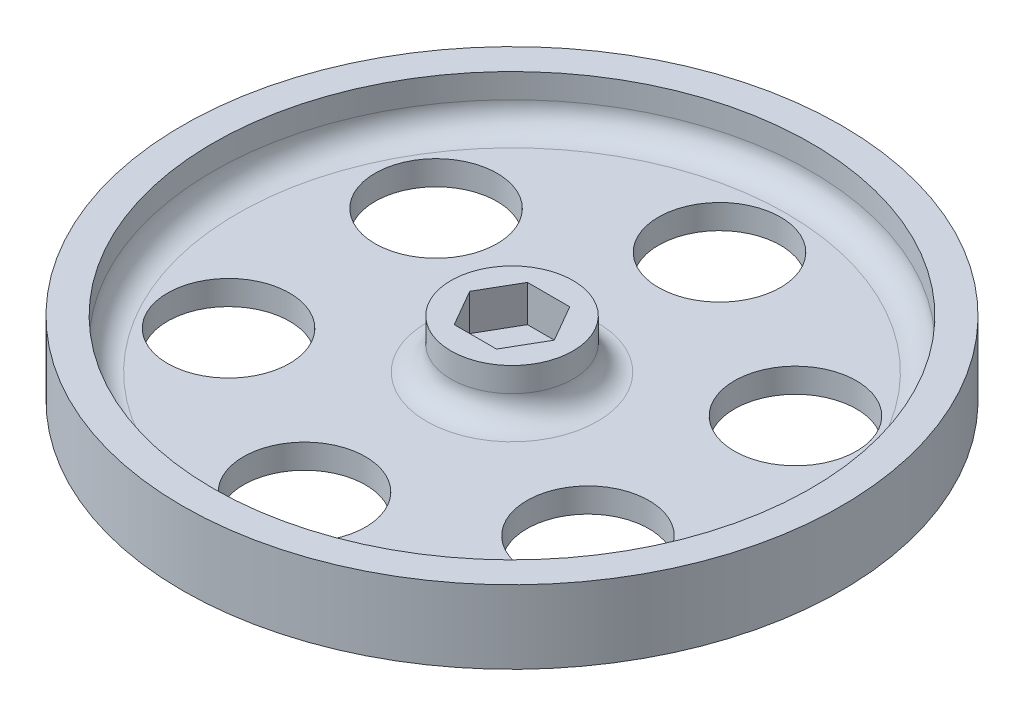
ISO-10303-21;
HEADER;
FILE_DESCRIPTION(('STEP AP214'),'2;1');
FILE_NAME('part.step','',(''),(''),'','','');
FILE_SCHEMA(('AUTOMOTIVE_DESIGN { 1 0 10303 214 1 1 1 1 }'));
ENDSEC;
DATA;
#1=APPLICATION_CONTEXT('core data for automotive mechanical design processes');
#2=APPLICATION_PROTOCOL_DEFINITION('international standard','automotive_design',2000,#1);
#3=PRODUCT_CONTEXT('',#1,'mechanical');
#4=PRODUCT('Part','Part','',(#3));
#5=PRODUCT_RELATED_PRODUCT_CATEGORY('part','',(#4));
#6=PRODUCT_DEFINITION_FORMATION('','',#4);
#7=PRODUCT_DEFINITION_CONTEXT('part definition',#1,'design');
#8=PRODUCT_DEFINITION('design','',#6,#7);
#9=PRODUCT_DEFINITION_SHAPE('','',#8);
#10=(LENGTH_UNIT() NAMED_UNIT(*) SI_UNIT(.MILLI.,.METRE.));
#11=(NAMED_UNIT(*) PLANE_ANGLE_UNIT() SI_UNIT($,.RADIAN.));
#12=(NAMED_UNIT(*) SI_UNIT($,.STERADIAN.) SOLID_ANGLE_UNIT());
#13=UNCERTAINTY_MEASURE_WITH_UNIT(LENGTH_MEASURE(1.E-05),#10,'distance_accuracy_value','');
#14=(GEOMETRIC_REPRESENTATION_CONTEXT(3) GLOBAL_UNCERTAINTY_ASSIGNED_CONTEXT((#13)) GLOBAL_UNIT_ASSIGNED_CONTEXT((#10,
#11,#12)) REPRESENTATION_CONTEXT('',''));
#15=CARTESIAN_POINT('',(0.,0.,0.));
#16=DIRECTION('',(0.,0.,1.));
#17=DIRECTION('',(1.,0.,0.));
#18=AXIS2_PLACEMENT_3D('',#15,#16,#17);
#19=CARTESIAN_POINT('',(0.,6.,0.));
#20=DIRECTION('',(0.,-1.,0.));
#21=DIRECTION('',(0.,0.,-1.));
#22=AXIS2_PLACEMENT_3D('',#19,#20,#21);
#23=CYLINDRICAL_SURFACE('',#22,54.);
#24=CARTESIAN_POINT('',(0.,6.,0.));
#25=DIRECTION('',(0.,1.,0.));
#26=DIRECTION('',(0.,0.,1.));
#27=AXIS2_PLACEMENT_3D('',#24,#25,#26);
#28=CIRCLE('',#27,54.);
#29=CARTESIAN_POINT('',(0.,6.,54.));
#30=VERTEX_POINT('',#29);
#31=EDGE_CURVE('E176',#30,#30,#28,.T.);
#32=ORIENTED_EDGE('',*,*,#31,.F.);
#33=EDGE_LOOP('',(#32));
#34=FACE_BOUND('',#33,.T.);
#35=CARTESIAN_POINT('',(0.,-6.,0.));
#36=DIRECTION('',(0.,1.,0.));
#37=DIRECTION('',(0.,0.,1.));
#38=AXIS2_PLACEMENT_3D('',#35,#36,#37);
#39=CIRCLE('',#38,54.);
#40=CARTESIAN_POINT('',(0.,-6.,54.));
#41=VERTEX_POINT('',#40);
#42=EDGE_CURVE('E175',#41,#41,#39,.T.);
#43=ORIENTED_EDGE('',*,*,#42,.T.);
#44=EDGE_LOOP('',(#43));
#45=FACE_BOUND('',#44,.T.);
#46=ADVANCED_FACE('F42',(#34,#45),#23,.T.);
#47=CARTESIAN_POINT('',(0.,6.,0.));
#48=DIRECTION('',(0.,1.,0.));
#49=DIRECTION('',(0.,0.,1.));
#50=AXIS2_PLACEMENT_3D('',#47,#48,#49);
#51=PLANE('',#50);
#52=CARTESIAN_POINT('',(0.,6.,0.));
#53=DIRECTION('',(0.,1.,0.));
#54=DIRECTION('',(0.,0.,1.));
#55=AXIS2_PLACEMENT_3D('',#52,#53,#54);
#56=CIRCLE('',#55,49.);
#57=CARTESIAN_POINT('',(0.,6.,49.));
#58=VERTEX_POINT('',#57);
#59=EDGE_CURVE('E171',#58,#58,#56,.T.);
#60=ORIENTED_EDGE('',*,*,#59,.F.);
#61=EDGE_LOOP('',(#60));
#62=FACE_BOUND('',#61,.T.);
#63=ORIENTED_EDGE('',*,*,#31,.T.);
#64=EDGE_LOOP('',(#63));
#65=FACE_BOUND('',#64,.T.);
#66=ADVANCED_FACE('F214',(#62,#65),#51,.T.);
#67=CARTESIAN_POINT('',(0.,-6.,0.));
#68=DIRECTION('',(0.,1.,0.));
#69=DIRECTION('',(0.,0.,1.));
#70=AXIS2_PLACEMENT_3D('',#67,#68,#69);
#71=PLANE('',#70);
#72=CARTESIAN_POINT('',(29.444863728671,-6.,-16.9999999999999));
#73=DIRECTION('',(0.,1.,0.));
#74=DIRECTION('',(0.,0.,1.));
#75=AXIS2_PLACEMENT_3D('',#72,#73,#74);
#76=CIRCLE('',#75,10.);
#77=CARTESIAN_POINT('',(29.444863728671,-6.,-6.99999999999993));
#78=VERTEX_POINT('',#77);
#79=EDGE_CURVE('E242',#78,#78,#76,.F.);
#80=ORIENTED_EDGE('',*,*,#79,.F.);
#81=EDGE_LOOP('',(#80));
#82=FACE_BOUND('',#81,.T.);
#83=CARTESIAN_POINT('',(29.4448637286708,-6.,17.0000000000001));
#84=DIRECTION('',(0.,1.,0.));
#85=DIRECTION('',(0.,0.,1.));
#86=AXIS2_PLACEMENT_3D('',#83,#84,#85);
#87=CIRCLE('',#86,10.);
#88=CARTESIAN_POINT('',(29.4448637286708,-6.,27.0000000000001));
#89=VERTEX_POINT('',#88);
#90=EDGE_CURVE('E246',#89,#89,#87,.F.);
#91=ORIENTED_EDGE('',*,*,#90,.F.);
#92=EDGE_LOOP('',(#91));
#93=FACE_BOUND('',#92,.T.);
#94=CARTESIAN_POINT('',(-2.37420731041333E-13,-6.,34.));
#95=DIRECTION('',(0.,1.,0.));
#96=DIRECTION('',(0.,0.,1.));
#97=AXIS2_PLACEMENT_3D('',#94,#95,#96);
#98=CIRCLE('',#97,10.);
#99=CARTESIAN_POINT('',(-2.37420731041333E-13,-6.,44.));
#100=VERTEX_POINT('',#99);
#101=EDGE_CURVE('E250',#100,#100,#98,.F.);
#102=ORIENTED_EDGE('',*,*,#101,.F.);
#103=EDGE_LOOP('',(#102));
#104=FACE_BOUND('',#103,.T.);
#105=CARTESIAN_POINT('',(-29.4448637286711,-6.,16.9999999999997));
#106=DIRECTION('',(0.,1.,0.));
#107=DIRECTION('',(0.,0.,1.));
#108=AXIS2_PLACEMENT_3D('',#105,#106,#107);
#109=CIRCLE('',#108,10.);
#110=CARTESIAN_POINT('',(-29.4448637286711,-6.,26.9999999999997));
#111=VERTEX_POINT('',#110);
#112=EDGE_CURVE('E254',#111,#111,#109,.F.);
#113=ORIENTED_EDGE('',*,*,#112,.F.);
#114=EDGE_LOOP('',(#113));
#115=FACE_BOUND('',#114,.T.);
#116=CARTESIAN_POINT('',(-29.4448637286707,-6.,-17.0000000000003));
#117=DIRECTION('',(0.,1.,0.));
#118=DIRECTION('',(0.,0.,1.));
#119=AXIS2_PLACEMENT_3D('',#116,#117,#118);
#120=CIRCLE('',#119,10.);
#121=CARTESIAN_POINT('',(-29.4448637286707,-6.,-7.00000000000034));
#122=VERTEX_POINT('',#121);
#123=EDGE_CURVE('E258',#122,#122,#120,.F.);
#124=ORIENTED_EDGE('',*,*,#123,.F.);
#125=EDGE_LOOP('',(#124));
#126=FACE_BOUND('',#125,.T.);
#127=CARTESIAN_POINT('',(0.,-6.,-34.));
#128=DIRECTION('',(0.,1.,0.));
#129=DIRECTION('',(0.,0.,1.));
#130=AXIS2_PLACEMENT_3D('',#127,#128,#129);
#131=CIRCLE('',#130,10.);
#132=CARTESIAN_POINT('',(0.,-6.,-24.));
#133=VERTEX_POINT('',#132);
#134=EDGE_CURVE('E262',#133,#133,#131,.F.);
#135=ORIENTED_EDGE('',*,*,#134,.F.);
#136=EDGE_LOOP('',(#135));
#137=FACE_BOUND('',#136,.T.);
#138=CARTESIAN_POINT('',(0.,-6.,0.));
#139=DIRECTION('',(0.,1.,0.));
#140=DIRECTION('',(0.,0.,1.));
#141=AXIS2_PLACEMENT_3D('',#138,#139,#140);
#142=CIRCLE('',#141,2.);
#143=CARTESIAN_POINT('',(0.,-6.,2.));
#144=VERTEX_POINT('',#143);
#145=EDGE_CURVE('E139',#144,#144,#142,.F.);
#146=ORIENTED_EDGE('',*,*,#145,.F.);
#147=EDGE_LOOP('',(#146));
#148=FACE_BOUND('',#147,.T.);
#149=ORIENTED_EDGE('',*,*,#42,.F.);
#150=EDGE_LOOP('',(#149));
#151=FACE_BOUND('',#150,.T.);
#152=ADVANCED_FACE('F223',(#82,#93,#104,#115,#126,#137,#148,#151),#71,.F.);
#153=CARTESIAN_POINT('',(0.,-2.,0.));
#154=DIRECTION('',(0.,1.,0.));
#155=DIRECTION('',(0.,0.,1.));
#156=AXIS2_PLACEMENT_3D('',#153,#154,#155);
#157=CYLINDRICAL_SURFACE('',#156,49.);
#158=CARTESIAN_POINT('',(0.,2.,0.));
#159=DIRECTION('',(0.,1.,0.));
#160=DIRECTION('',(0.,0.,1.));
#161=AXIS2_PLACEMENT_3D('',#158,#159,#160);
#162=CIRCLE('',#161,49.);
#163=CARTESIAN_POINT('',(0.,2.,49.));
#164=VERTEX_POINT('',#163);
#165=EDGE_CURVE('E11',#164,#164,#162,.F.);
#166=ORIENTED_EDGE('',*,*,#165,.T.);
#167=EDGE_LOOP('',(#166));
#168=FACE_BOUND('',#167,.T.);
#169=ORIENTED_EDGE('',*,*,#59,.T.);
#170=EDGE_LOOP('',(#169));
#171=FACE_BOUND('',#170,.T.);
#172=ADVANCED_FACE('F233',(#168,#171),#157,.F.);
#173=CARTESIAN_POINT('',(0.,-2.,0.));
#174=DIRECTION('',(0.,1.,0.));
#175=DIRECTION('',(0.,0.,1.));
#176=AXIS2_PLACEMENT_3D('',#173,#174,#175);
#177=PLANE('',#176);
#178=CARTESIAN_POINT('',(0.,-2.,0.));
#179=DIRECTION('',(0.,1.,0.));
#180=DIRECTION('',(0.,0.,1.));
#181=AXIS2_PLACEMENT_3D('',#178,#179,#180);
#182=CIRCLE('',#181,14.);
#183=CARTESIAN_POINT('',(0.,-2.,14.));
#184=VERTEX_POINT('',#183);
#185=EDGE_CURVE('E51',#184,#184,#182,.F.);
#186=ORIENTED_EDGE('',*,*,#185,.T.);
#187=EDGE_LOOP('',(#186));
#188=FACE_BOUND('',#187,.T.);
#189=CARTESIAN_POINT('',(0.,-2.,0.));
#190=DIRECTION('',(0.,1.,0.));
#191=DIRECTION('',(0.,0.,1.));
#192=AXIS2_PLACEMENT_3D('',#189,#190,#191);
#193=CIRCLE('',#192,45.);
#194=CARTESIAN_POINT('',(0.,-2.,45.));
#195=VERTEX_POINT('',#194);
#196=EDGE_CURVE('E187',#195,#195,#193,.T.);
#197=ORIENTED_EDGE('',*,*,#196,.T.);
#198=EDGE_LOOP('',(#197));
#199=FACE_BOUND('',#198,.T.);
#200=CARTESIAN_POINT('',(29.444863728671,-2.,-16.9999999999999));
#201=DIRECTION('',(0.,1.,0.));
#202=DIRECTION('',(0.,0.,1.));
#203=AXIS2_PLACEMENT_3D('',#200,#201,#202);
#204=CIRCLE('',#203,10.);
#205=CARTESIAN_POINT('',(29.444863728671,-2.,-6.99999999999993));
#206=VERTEX_POINT('',#205);
#207=EDGE_CURVE('E514',#206,#206,#204,.T.);
#208=ORIENTED_EDGE('',*,*,#207,.F.);
#209=EDGE_LOOP('',(#208));
#210=FACE_BOUND('',#209,.T.);
#211=CARTESIAN_POINT('',(29.4448637286708,-2.,17.0000000000001));
#212=DIRECTION('',(0.,1.,0.));
#213=DIRECTION('',(0.,0.,1.));
#214=AXIS2_PLACEMENT_3D('',#211,#212,#213);
#215=CIRCLE('',#214,10.);
#216=CARTESIAN_POINT('',(29.4448637286708,-2.,27.0000000000001));
#217=VERTEX_POINT('',#216);
#218=EDGE_CURVE('E534',#217,#217,#215,.T.);
#219=ORIENTED_EDGE('',*,*,#218,.F.);
#220=EDGE_LOOP('',(#219));
#221=FACE_BOUND('',#220,.T.);
#222=CARTESIAN_POINT('',(-2.37420731041333E-13,-2.,34.));
#223=DIRECTION('',(0.,1.,0.));
#224=DIRECTION('',(0.,0.,1.));
#225=AXIS2_PLACEMENT_3D('',#222,#223,#224);
#226=CIRCLE('',#225,10.);
#227=CARTESIAN_POINT('',(-2.37420731041333E-13,-2.,44.));
#228=VERTEX_POINT('',#227);
#229=EDGE_CURVE('E528',#228,#228,#226,.T.);
#230=ORIENTED_EDGE('',*,*,#229,.F.);
#231=EDGE_LOOP('',(#230));
#232=FACE_BOUND('',#231,.T.);
#233=CARTESIAN_POINT('',(-29.4448637286711,-2.,16.9999999999997));
#234=DIRECTION('',(0.,1.,0.));
#235=DIRECTION('',(0.,0.,1.));
#236=AXIS2_PLACEMENT_3D('',#233,#234,#235);
#237=CIRCLE('',#236,10.);
#238=CARTESIAN_POINT('',(-29.4448637286711,-2.,26.9999999999997));
#239=VERTEX_POINT('',#238);
#240=EDGE_CURVE('E521',#239,#239,#237,.T.);
#241=ORIENTED_EDGE('',*,*,#240,.F.);
#242=EDGE_LOOP('',(#241));
#243=FACE_BOUND('',#242,.T.);
#244=CARTESIAN_POINT('',(-29.4448637286707,-2.,-17.0000000000003));
#245=DIRECTION('',(0.,1.,0.));
#246=DIRECTION('',(0.,0.,1.));
#247=AXIS2_PLACEMENT_3D('',#244,#245,#246);
#248=CIRCLE('',#247,10.);
#249=CARTESIAN_POINT('',(-29.4448637286707,-2.,-7.00000000000034));
#250=VERTEX_POINT('',#249);
#251=EDGE_CURVE('E527',#250,#250,#248,.T.);
#252=ORIENTED_EDGE('',*,*,#251,.F.);
#253=EDGE_LOOP('',(#252));
#254=FACE_BOUND('',#253,.T.);
#255=CARTESIAN_POINT('',(0.,-2.,-34.));
#256=DIRECTION('',(0.,1.,0.));
#257=DIRECTION('',(0.,0.,1.));
#258=AXIS2_PLACEMENT_3D('',#255,#256,#257);
#259=CIRCLE('',#258,10.);
#260=CARTESIAN_POINT('',(0.,-2.,-24.));
#261=VERTEX_POINT('',#260);
#262=EDGE_CURVE('E511',#261,#261,#259,.T.);
#263=ORIENTED_EDGE('',*,*,#262,.F.);
#264=EDGE_LOOP('',(#263));
#265=FACE_BOUND('',#264,.T.);
#266=ADVANCED_FACE('F194',(#188,#199,#210,#221,#232,#243,#254,#265),#177,.T.);
#267=CARTESIAN_POINT('',(0.,-2.,0.));
#268=DIRECTION('',(0.,1.,0.));
#269=DIRECTION('',(0.,0.,1.));
#270=AXIS2_PLACEMENT_3D('',#267,#268,#269);
#271=CYLINDRICAL_SURFACE('',#270,10.);
#272=CARTESIAN_POINT('',(0.,2.,0.));
#273=DIRECTION('',(0.,1.,0.));
#274=DIRECTION('',(0.,0.,1.));
#275=AXIS2_PLACEMENT_3D('',#272,#273,#274);
#276=CIRCLE('',#275,10.);
#277=CARTESIAN_POINT('',(0.,2.,10.));
#278=VERTEX_POINT('',#277);
#279=EDGE_CURVE('E180',#278,#278,#276,.T.);
#280=ORIENTED_EDGE('',*,*,#279,.T.);
#281=EDGE_LOOP('',(#280));
#282=FACE_BOUND('',#281,.T.);
#283=CARTESIAN_POINT('',(0.,6.,0.));
#284=DIRECTION('',(0.,1.,0.));
#285=DIRECTION('',(0.,0.,1.));
#286=AXIS2_PLACEMENT_3D('',#283,#284,#285);
#287=CIRCLE('',#286,10.);
#288=CARTESIAN_POINT('',(0.,6.,10.));
#289=VERTEX_POINT('',#288);
#290=EDGE_CURVE('E158',#289,#289,#287,.T.);
#291=ORIENTED_EDGE('',*,*,#290,.F.);
#292=EDGE_LOOP('',(#291));
#293=FACE_BOUND('',#292,.T.);
#294=ADVANCED_FACE('F203',(#282,#293),#271,.T.);
#295=DIRECTION('',(0.5,0.,-0.866025403784438));
#296=VECTOR('',#295,1.);
#297=CARTESIAN_POINT('',(3.46410161513775,6.,6.));
#298=LINE('',#297,#296);
#299=CARTESIAN_POINT('',(3.46410161513775,6.,6.));
#300=VERTEX_POINT('',#299);
#301=CARTESIAN_POINT('',(6.92820323027551,6.,0.));
#302=VERTEX_POINT('',#301);
#303=EDGE_CURVE('E58',#300,#302,#298,.T.);
#304=ORIENTED_EDGE('',*,*,#303,.F.);
#305=DIRECTION('',(1.,0.,0.));
#306=VECTOR('',#305,1.);
#307=CARTESIAN_POINT('',(-3.46410161513776,6.,6.));
#308=LINE('',#307,#306);
#309=CARTESIAN_POINT('',(-3.46410161513776,6.,6.));
#310=VERTEX_POINT('',#309);
#311=EDGE_CURVE('E152',#310,#300,#308,.T.);
#312=ORIENTED_EDGE('',*,*,#311,.F.);
#313=DIRECTION('',(0.5,0.,0.866025403784439));
#314=VECTOR('',#313,1.);
#315=CARTESIAN_POINT('',(-6.92820323027551,6.,0.));
#316=LINE('',#315,#314);
#317=CARTESIAN_POINT('',(-6.92820323027551,6.,0.));
#318=VERTEX_POINT('',#317);
#319=EDGE_CURVE('E149',#318,#310,#316,.T.);
#320=ORIENTED_EDGE('',*,*,#319,.F.);
#321=DIRECTION('',(-0.5,0.,0.866025403784439));
#322=VECTOR('',#321,1.);
#323=CARTESIAN_POINT('',(-3.46410161513776,6.,-6.));
#324=LINE('',#323,#322);
#325=CARTESIAN_POINT('',(-3.46410161513776,6.,-6.));
#326=VERTEX_POINT('',#325);
#327=EDGE_CURVE('E106',#326,#318,#324,.T.);
#328=ORIENTED_EDGE('',*,*,#327,.F.);
#329=DIRECTION('',(-1.,0.,0.));
#330=VECTOR('',#329,1.);
#331=CARTESIAN_POINT('',(3.46410161513775,6.,-6.));
#332=LINE('',#331,#330);
#333=CARTESIAN_POINT('',(3.46410161513775,6.,-6.));
#334=VERTEX_POINT('',#333);
#335=EDGE_CURVE('E143',#334,#326,#332,.T.);
#336=ORIENTED_EDGE('',*,*,#335,.F.);
#337=DIRECTION('',(-0.5,0.,-0.866025403784439));
#338=VECTOR('',#337,1.);
#339=CARTESIAN_POINT('',(6.92820323027551,6.,0.));
#340=LINE('',#339,#338);
#341=EDGE_CURVE('E138',#302,#334,#340,.T.);
#342=ORIENTED_EDGE('',*,*,#341,.F.);
#343=EDGE_LOOP('',(#304,#312,#320,#328,#336,#342));
#344=FACE_BOUND('',#343,.T.);
#345=ORIENTED_EDGE('',*,*,#290,.T.);
#346=EDGE_LOOP('',(#345));
#347=FACE_BOUND('',#346,.T.);
#348=ADVANCED_FACE('F206',(#344,#347),#51,.T.);
#349=CARTESIAN_POINT('',(3.46410161513775,0.,6.));
#350=DIRECTION('',(0.866025403784439,0.,0.5));
#351=DIRECTION('',(0.5,0.,-0.866025403784439));
#352=AXIS2_PLACEMENT_3D('',#349,#350,#351);
#353=PLANE('',#352);
#354=ORIENTED_EDGE('',*,*,#303,.T.);
#355=DIRECTION('',(0.,1.,0.));
#356=VECTOR('',#355,1.);
#357=CARTESIAN_POINT('',(6.92820323027551,0.,0.));
#358=LINE('',#357,#356);
#359=CARTESIAN_POINT('',(6.92820323027551,0.,0.));
#360=VERTEX_POINT('',#359);
#361=EDGE_CURVE('E88',#360,#302,#358,.T.);
#362=ORIENTED_EDGE('',*,*,#361,.F.);
#363=DIRECTION('',(0.5,0.,-0.866025403784438));
#364=VECTOR('',#363,1.);
#365=CARTESIAN_POINT('',(3.46410161513775,0.,6.));
#366=LINE('',#365,#364);
#367=CARTESIAN_POINT('',(3.46410161513775,0.,6.));
#368=VERTEX_POINT('',#367);
#369=EDGE_CURVE('E155',#368,#360,#366,.T.);
#370=ORIENTED_EDGE('',*,*,#369,.F.);
#371=DIRECTION('',(0.,1.,0.));
#372=VECTOR('',#371,1.);
#373=CARTESIAN_POINT('',(3.46410161513775,0.,6.));
#374=LINE('',#373,#372);
#375=EDGE_CURVE('E66',#368,#300,#374,.T.);
#376=ORIENTED_EDGE('',*,*,#375,.T.);
#377=EDGE_LOOP('',(#354,#362,#370,#376));
#378=FACE_BOUND('',#377,.T.);
#379=ADVANCED_FACE('F211',(#378),#353,.F.);
#380=CARTESIAN_POINT('',(-3.46410161513776,0.,6.));
#381=DIRECTION('',(0.,0.,1.));
#382=DIRECTION('',(1.,0.,0.));
#383=AXIS2_PLACEMENT_3D('',#380,#381,#382);
#384=PLANE('',#383);
#385=ORIENTED_EDGE('',*,*,#311,.T.);
#386=ORIENTED_EDGE('',*,*,#375,.F.);
#387=DIRECTION('',(1.,0.,0.));
#388=VECTOR('',#387,1.);
#389=CARTESIAN_POINT('',(-3.46410161513776,0.,6.));
#390=LINE('',#389,#388);
#391=CARTESIAN_POINT('',(-3.46410161513776,0.,6.));
#392=VERTEX_POINT('',#391);
#393=EDGE_CURVE('E120',#392,#368,#390,.T.);
#394=ORIENTED_EDGE('',*,*,#393,.F.);
#395=DIRECTION('',(0.,1.,0.));
#396=VECTOR('',#395,1.);
#397=CARTESIAN_POINT('',(-3.46410161513776,0.,6.));
#398=LINE('',#397,#396);
#399=EDGE_CURVE('E111',#392,#310,#398,.T.);
#400=ORIENTED_EDGE('',*,*,#399,.T.);
#401=EDGE_LOOP('',(#385,#386,#394,#400));
#402=FACE_BOUND('',#401,.T.);
#403=ADVANCED_FACE('F218',(#402),#384,.F.);
#404=CARTESIAN_POINT('',(-6.92820323027551,0.,0.));
#405=DIRECTION('',(-0.866025403784439,0.,0.5));
#406=DIRECTION('',(0.5,0.,0.866025403784439));
#407=AXIS2_PLACEMENT_3D('',#404,#405,#406);
#408=PLANE('',#407);
#409=ORIENTED_EDGE('',*,*,#319,.T.);
#410=ORIENTED_EDGE('',*,*,#399,.F.);
#411=DIRECTION('',(0.5,0.,0.866025403784439));
#412=VECTOR('',#411,1.);
#413=CARTESIAN_POINT('',(-6.92820323027551,0.,0.));
#414=LINE('',#413,#412);
#415=CARTESIAN_POINT('',(-6.92820323027551,0.,0.));
#416=VERTEX_POINT('',#415);
#417=EDGE_CURVE('E115',#416,#392,#414,.T.);
#418=ORIENTED_EDGE('',*,*,#417,.F.);
#419=DIRECTION('',(0.,1.,0.));
#420=VECTOR('',#419,1.);
#421=CARTESIAN_POINT('',(-6.92820323027551,0.,0.));
#422=LINE('',#421,#420);
#423=EDGE_CURVE('E99',#416,#318,#422,.T.);
#424=ORIENTED_EDGE('',*,*,#423,.T.);
#425=EDGE_LOOP('',(#409,#410,#418,#424));
#426=FACE_BOUND('',#425,.T.);
#427=ADVANCED_FACE('F116',(#426),#408,.F.);
#428=CARTESIAN_POINT('',(-3.46410161513776,0.,-6.));
#429=DIRECTION('',(-0.866025403784439,0.,-0.5));
#430=DIRECTION('',(-0.5,0.,0.866025403784439));
#431=AXIS2_PLACEMENT_3D('',#428,#429,#430);
#432=PLANE('',#431);
#433=ORIENTED_EDGE('',*,*,#327,.T.);
#434=ORIENTED_EDGE('',*,*,#423,.F.);
#435=DIRECTION('',(-0.5,0.,0.866025403784439));
#436=VECTOR('',#435,1.);
#437=CARTESIAN_POINT('',(-3.46410161513776,0.,-6.));
#438=LINE('',#437,#436);
#439=CARTESIAN_POINT('',(-3.46410161513776,0.,-6.));
#440=VERTEX_POINT('',#439);
#441=EDGE_CURVE('E103',#440,#416,#438,.T.);
#442=ORIENTED_EDGE('',*,*,#441,.F.);
#443=DIRECTION('',(0.,1.,0.));
#444=VECTOR('',#443,1.);
#445=CARTESIAN_POINT('',(-3.46410161513776,0.,-6.));
#446=LINE('',#445,#444);
#447=EDGE_CURVE('E112',#440,#326,#446,.T.);
#448=ORIENTED_EDGE('',*,*,#447,.T.);
#449=EDGE_LOOP('',(#433,#434,#442,#448));
#450=FACE_BOUND('',#449,.T.);
#451=ADVANCED_FACE('F101',(#450),#432,.F.);
#452=CARTESIAN_POINT('',(3.46410161513775,0.,-6.));
#453=DIRECTION('',(0.,0.,-1.));
#454=DIRECTION('',(-1.,0.,0.));
#455=AXIS2_PLACEMENT_3D('',#452,#453,#454);
#456=PLANE('',#455);
#457=ORIENTED_EDGE('',*,*,#335,.T.);
#458=ORIENTED_EDGE('',*,*,#447,.F.);
#459=DIRECTION('',(-1.,0.,0.));
#460=VECTOR('',#459,1.);
#461=CARTESIAN_POINT('',(3.46410161513775,0.,-6.));
#462=LINE('',#461,#460);
#463=CARTESIAN_POINT('',(3.46410161513775,0.,-6.));
#464=VERTEX_POINT('',#463);
#465=EDGE_CURVE('E126',#464,#440,#462,.T.);
#466=ORIENTED_EDGE('',*,*,#465,.F.);
#467=DIRECTION('',(0.,1.,0.));
#468=VECTOR('',#467,1.);
#469=CARTESIAN_POINT('',(3.46410161513775,0.,-6.));
#470=LINE('',#469,#468);
#471=EDGE_CURVE('E163',#464,#334,#470,.T.);
#472=ORIENTED_EDGE('',*,*,#471,.T.);
#473=EDGE_LOOP('',(#457,#458,#466,#472));
#474=FACE_BOUND('',#473,.T.);
#475=ADVANCED_FACE('F283',(#474),#456,.F.);
#476=CARTESIAN_POINT('',(6.92820323027551,0.,0.));
#477=DIRECTION('',(0.866025403784439,0.,-0.5));
#478=DIRECTION('',(-0.5,0.,-0.866025403784439));
#479=AXIS2_PLACEMENT_3D('',#476,#477,#478);
#480=PLANE('',#479);
#481=ORIENTED_EDGE('',*,*,#341,.T.);
#482=ORIENTED_EDGE('',*,*,#471,.F.);
#483=DIRECTION('',(-0.5,0.,-0.866025403784439));
#484=VECTOR('',#483,1.);
#485=CARTESIAN_POINT('',(6.92820323027551,0.,0.));
#486=LINE('',#485,#484);
#487=EDGE_CURVE('E130',#360,#464,#486,.T.);
#488=ORIENTED_EDGE('',*,*,#487,.F.);
#489=ORIENTED_EDGE('',*,*,#361,.T.);
#490=EDGE_LOOP('',(#481,#482,#488,#489));
#491=FACE_BOUND('',#490,.T.);
#492=ADVANCED_FACE('F279',(#491),#480,.F.);
#493=CARTESIAN_POINT('',(0.,0.,0.));
#494=DIRECTION('',(0.,1.,0.));
#495=DIRECTION('',(0.,0.,1.));
#496=AXIS2_PLACEMENT_3D('',#493,#494,#495);
#497=PLANE('',#496);
#498=CARTESIAN_POINT('',(0.,0.,0.));
#499=DIRECTION('',(0.,1.,0.));
#500=DIRECTION('',(0.,0.,1.));
#501=AXIS2_PLACEMENT_3D('',#498,#499,#500);
#502=CIRCLE('',#501,2.);
#503=CARTESIAN_POINT('',(0.,0.,2.));
#504=VERTEX_POINT('',#503);
#505=EDGE_CURVE('E269',#504,#504,#502,.T.);
#506=ORIENTED_EDGE('',*,*,#505,.F.);
#507=EDGE_LOOP('',(#506));
#508=FACE_BOUND('',#507,.T.);
#509=ORIENTED_EDGE('',*,*,#369,.T.);
#510=ORIENTED_EDGE('',*,*,#487,.T.);
#511=ORIENTED_EDGE('',*,*,#465,.T.);
#512=ORIENTED_EDGE('',*,*,#441,.T.);
#513=ORIENTED_EDGE('',*,*,#417,.T.);
#514=ORIENTED_EDGE('',*,*,#393,.T.);
#515=EDGE_LOOP('',(#509,#510,#511,#512,#513,#514));
#516=FACE_BOUND('',#515,.T.);
#517=ADVANCED_FACE('F123',(#508,#516),#497,.T.);
#518=CARTESIAN_POINT('',(0.,-11.6568542494924,0.));
#519=DIRECTION('',(0.,1.,0.));
#520=DIRECTION('',(0.,0.,1.));
#521=AXIS2_PLACEMENT_3D('',#518,#519,#520);
#522=CYLINDRICAL_SURFACE('',#521,2.);
#523=ORIENTED_EDGE('',*,*,#145,.T.);
#524=EDGE_LOOP('',(#523));
#525=FACE_BOUND('',#524,.T.);
#526=ORIENTED_EDGE('',*,*,#505,.T.);
#527=EDGE_LOOP('',(#526));
#528=FACE_BOUND('',#527,.T.);
#529=ADVANCED_FACE('F388',(#525,#528),#522,.F.);
#530=CARTESIAN_POINT('',(0.,-34.2842712474619,-34.));
#531=DIRECTION('',(0.,1.,0.));
#532=DIRECTION('',(0.,0.,1.));
#533=AXIS2_PLACEMENT_3D('',#530,#531,#532);
#534=CYLINDRICAL_SURFACE('',#533,10.);
#535=ORIENTED_EDGE('',*,*,#134,.T.);
#536=EDGE_LOOP('',(#535));
#537=FACE_BOUND('',#536,.T.);
#538=ORIENTED_EDGE('',*,*,#262,.T.);
#539=EDGE_LOOP('',(#538));
#540=FACE_BOUND('',#539,.T.);
#541=ADVANCED_FACE('F378',(#537,#540),#534,.F.);
#542=CARTESIAN_POINT('',(-29.4448637286707,-34.2842712474619,-17.0000000000003));
#543=DIRECTION('',(0.,1.,0.));
#544=DIRECTION('',(0.,0.,1.));
#545=AXIS2_PLACEMENT_3D('',#542,#543,#544);
#546=CYLINDRICAL_SURFACE('',#545,10.);
#547=ORIENTED_EDGE('',*,*,#123,.T.);
#548=EDGE_LOOP('',(#547));
#549=FACE_BOUND('',#548,.T.);
#550=ORIENTED_EDGE('',*,*,#251,.T.);
#551=EDGE_LOOP('',(#550));
#552=FACE_BOUND('',#551,.T.);
#553=ADVANCED_FACE('F368',(#549,#552),#546,.F.);
#554=CARTESIAN_POINT('',(-29.4448637286711,-34.2842712474619,16.9999999999997));
#555=DIRECTION('',(0.,1.,0.));
#556=DIRECTION('',(0.,0.,1.));
#557=AXIS2_PLACEMENT_3D('',#554,#555,#556);
#558=CYLINDRICAL_SURFACE('',#557,10.);
#559=ORIENTED_EDGE('',*,*,#112,.T.);
#560=EDGE_LOOP('',(#559));
#561=FACE_BOUND('',#560,.T.);
#562=ORIENTED_EDGE('',*,*,#240,.T.);
#563=EDGE_LOOP('',(#562));
#564=FACE_BOUND('',#563,.T.);
#565=ADVANCED_FACE('F358',(#561,#564),#558,.F.);
#566=CARTESIAN_POINT('',(-2.37420731041333E-13,-34.2842712474619,34.));
#567=DIRECTION('',(0.,1.,0.));
#568=DIRECTION('',(0.,0.,1.));
#569=AXIS2_PLACEMENT_3D('',#566,#567,#568);
#570=CYLINDRICAL_SURFACE('',#569,10.);
#571=ORIENTED_EDGE('',*,*,#101,.T.);
#572=EDGE_LOOP('',(#571));
#573=FACE_BOUND('',#572,.T.);
#574=ORIENTED_EDGE('',*,*,#229,.T.);
#575=EDGE_LOOP('',(#574));
#576=FACE_BOUND('',#575,.T.);
#577=ADVANCED_FACE('F348',(#573,#576),#570,.F.);
#578=CARTESIAN_POINT('',(29.4448637286708,-34.2842712474619,17.0000000000001));
#579=DIRECTION('',(0.,1.,0.));
#580=DIRECTION('',(0.,0.,1.));
#581=AXIS2_PLACEMENT_3D('',#578,#579,#580);
#582=CYLINDRICAL_SURFACE('',#581,10.);
#583=ORIENTED_EDGE('',*,*,#90,.T.);
#584=EDGE_LOOP('',(#583));
#585=FACE_BOUND('',#584,.T.);
#586=ORIENTED_EDGE('',*,*,#218,.T.);
#587=EDGE_LOOP('',(#586));
#588=FACE_BOUND('',#587,.T.);
#589=ADVANCED_FACE('F338',(#585,#588),#582,.F.);
#590=CARTESIAN_POINT('',(29.444863728671,-34.2842712474619,-16.9999999999999));
#591=DIRECTION('',(0.,1.,0.));
#592=DIRECTION('',(0.,0.,1.));
#593=AXIS2_PLACEMENT_3D('',#590,#591,#592);
#594=CYLINDRICAL_SURFACE('',#593,10.);
#595=ORIENTED_EDGE('',*,*,#79,.T.);
#596=EDGE_LOOP('',(#595));
#597=FACE_BOUND('',#596,.T.);
#598=ORIENTED_EDGE('',*,*,#207,.T.);
#599=EDGE_LOOP('',(#598));
#600=FACE_BOUND('',#599,.T.);
#601=ADVANCED_FACE('F200',(#597,#600),#594,.F.);
#602=CARTESIAN_POINT('',(0.,2.,0.));
#603=DIRECTION('',(0.,1.,0.));
#604=DIRECTION('',(0.,0.,1.));
#605=AXIS2_PLACEMENT_3D('',#602,#603,#604);
#606=TOROIDAL_SURFACE('',#605,14.,4.);
#607=ORIENTED_EDGE('',*,*,#185,.F.);
#608=EDGE_LOOP('',(#607));
#609=FACE_BOUND('',#608,.T.);
#610=ORIENTED_EDGE('',*,*,#279,.F.);
#611=EDGE_LOOP('',(#610));
#612=FACE_BOUND('',#611,.T.);
#613=ADVANCED_FACE('F197',(#609,#612),#606,.F.);
#614=CARTESIAN_POINT('',(0.,2.,0.));
#615=DIRECTION('',(0.,1.,0.));
#616=DIRECTION('',(0.,0.,1.));
#617=AXIS2_PLACEMENT_3D('',#614,#615,#616);
#618=TOROIDAL_SURFACE('',#617,45.,4.);
#619=ORIENTED_EDGE('',*,*,#165,.F.);
#620=EDGE_LOOP('',(#619));
#621=FACE_BOUND('',#620,.T.);
#622=ORIENTED_EDGE('',*,*,#196,.F.);
#623=EDGE_LOOP('',(#622));
#624=FACE_BOUND('',#623,.T.);
#625=ADVANCED_FACE('F44',(#621,#624),#618,.F.);
#626=CLOSED_SHELL('',(#46,#66,#152,#172,#266,#294,#348,#379,#403,#427,#451,#475,#492,#517,#529,
#541,#553,#565,#577,#589,#601,#613,#625));
#627=MANIFOLD_SOLID_BREP('B2',#626);
#628=ADVANCED_BREP_SHAPE_REPRESENTATION('',(#18,#627),#14);
#629=SHAPE_DEFINITION_REPRESENTATION(#9,#628);
ENDSEC;
END-ISO-10303-21;
